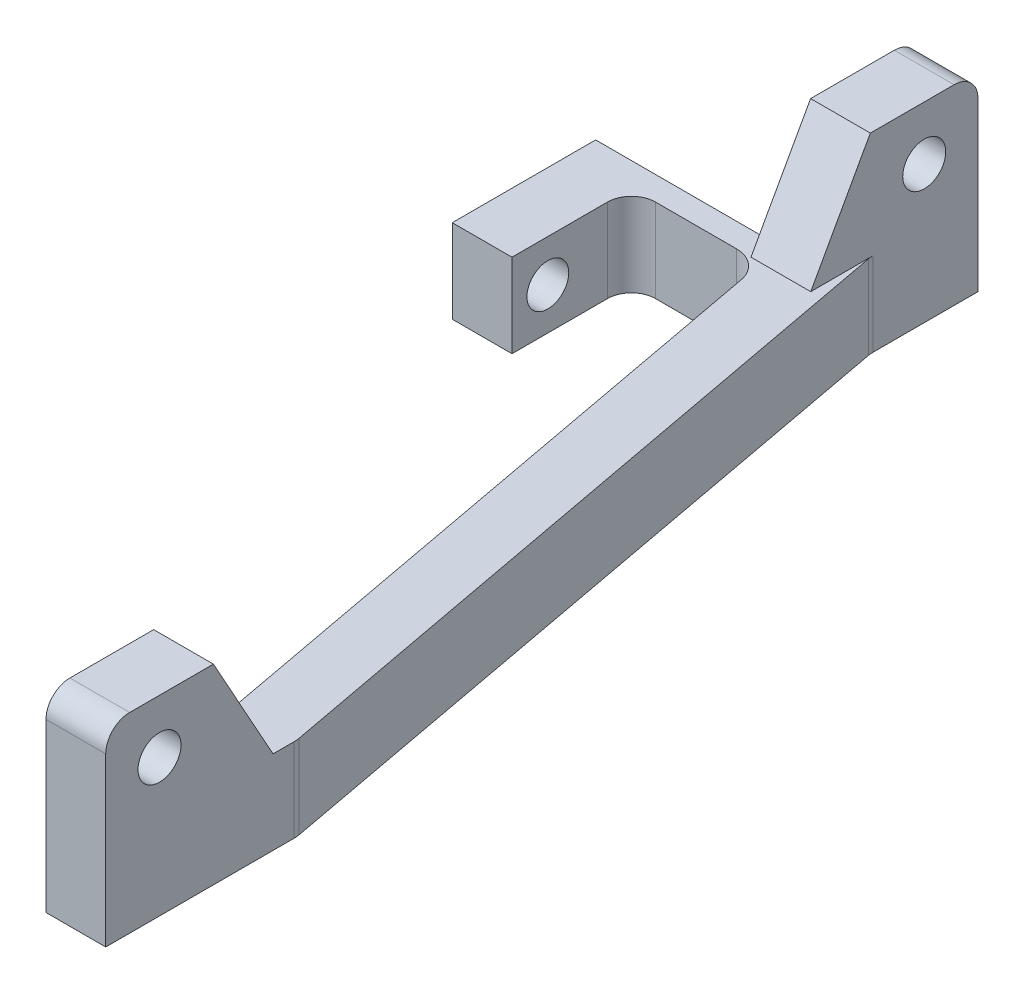
ISO-10303-21;
HEADER;
FILE_DESCRIPTION(('STEP AP214'),'2;1');
FILE_NAME('part.step','',(''),(''),'','','');
FILE_SCHEMA(('AUTOMOTIVE_DESIGN { 1 0 10303 214 1 1 1 1 }'));
ENDSEC;
DATA;
#1=APPLICATION_CONTEXT('core data for automotive mechanical design processes');
#2=APPLICATION_PROTOCOL_DEFINITION('international standard','automotive_design',2000,#1);
#3=PRODUCT_CONTEXT('',#1,'mechanical');
#4=PRODUCT('Part','Part','',(#3));
#5=PRODUCT_RELATED_PRODUCT_CATEGORY('part','',(#4));
#6=PRODUCT_DEFINITION_FORMATION('','',#4);
#7=PRODUCT_DEFINITION_CONTEXT('part definition',#1,'design');
#8=PRODUCT_DEFINITION('design','',#6,#7);
#9=PRODUCT_DEFINITION_SHAPE('','',#8);
#10=(LENGTH_UNIT() NAMED_UNIT(*) SI_UNIT(.MILLI.,.METRE.));
#11=(NAMED_UNIT(*) PLANE_ANGLE_UNIT() SI_UNIT($,.RADIAN.));
#12=(NAMED_UNIT(*) SI_UNIT($,.STERADIAN.) SOLID_ANGLE_UNIT());
#13=UNCERTAINTY_MEASURE_WITH_UNIT(LENGTH_MEASURE(1.E-05),#10,'distance_accuracy_value','');
#14=(GEOMETRIC_REPRESENTATION_CONTEXT(3) GLOBAL_UNCERTAINTY_ASSIGNED_CONTEXT((#13)) GLOBAL_UNIT_ASSIGNED_CONTEXT((#10,
#11,#12)) REPRESENTATION_CONTEXT('',''));
#15=CARTESIAN_POINT('',(0.,0.,0.));
#16=DIRECTION('',(0.,0.,1.));
#17=DIRECTION('',(1.,0.,0.));
#18=AXIS2_PLACEMENT_3D('',#15,#16,#17);
#19=CARTESIAN_POINT('',(0.,7.,0.));
#20=DIRECTION('',(0.,1.,0.));
#21=DIRECTION('',(0.,0.,1.));
#22=AXIS2_PLACEMENT_3D('',#19,#20,#21);
#23=PLANE('',#22);
#24=DIRECTION('',(-1.,0.,0.));
#25=VECTOR('',#24,1.);
#26=CARTESIAN_POINT('',(0.,7.,-63.));
#27=LINE('',#26,#25);
#28=CARTESIAN_POINT('',(12.5,7.,-63.));
#29=VERTEX_POINT('',#28);
#30=CARTESIAN_POINT('',(-2.50000000000002,7.,-63.));
#31=VERTEX_POINT('',#30);
#32=EDGE_CURVE('E357',#29,#31,#27,.T.);
#33=ORIENTED_EDGE('',*,*,#32,.T.);
#34=DIRECTION('',(0.,0.,1.));
#35=VECTOR('',#34,1.);
#36=CARTESIAN_POINT('',(-2.50000000000002,7.00000000000001,-75.002));
#37=LINE('',#36,#35);
#38=CARTESIAN_POINT('',(-2.50000000000002,7.00000000000001,-51.));
#39=VERTEX_POINT('',#38);
#40=EDGE_CURVE('E238',#31,#39,#37,.T.);
#41=ORIENTED_EDGE('',*,*,#40,.T.);
#42=DIRECTION('',(-1.,0.,0.));
#43=VECTOR('',#42,1.);
#44=CARTESIAN_POINT('',(-2.50000000000002,7.00000000000001,-51.));
#45=LINE('',#44,#43);
#46=CARTESIAN_POINT('',(2.49999999999998,7.00000000000001,-51.));
#47=VERTEX_POINT('',#46);
#48=EDGE_CURVE('E366',#47,#39,#45,.T.);
#49=ORIENTED_EDGE('',*,*,#48,.F.);
#50=DIRECTION('',(0.,0.,1.));
#51=VECTOR('',#50,1.);
#52=CARTESIAN_POINT('',(2.49999999999998,7.00000000000001,-75.002));
#53=LINE('',#52,#51);
#54=CARTESIAN_POINT('',(2.49999999999998,7.00000000000001,-59.));
#55=VERTEX_POINT('',#54);
#56=EDGE_CURVE('E392',#55,#47,#53,.T.);
#57=ORIENTED_EDGE('',*,*,#56,.F.);
#58=CARTESIAN_POINT('',(4.49999999999998,7.,-59.));
#59=DIRECTION('',(0.,1.,0.));
#60=DIRECTION('',(0.,0.,1.));
#61=AXIS2_PLACEMENT_3D('',#58,#59,#60);
#62=CIRCLE('',#61,2.);
#63=CARTESIAN_POINT('',(4.49999999999998,7.,-61.));
#64=VERTEX_POINT('',#63);
#65=EDGE_CURVE('E49',#55,#64,#62,.F.);
#66=ORIENTED_EDGE('',*,*,#65,.T.);
#67=DIRECTION('',(-1.,0.,0.));
#68=VECTOR('',#67,1.);
#69=CARTESIAN_POINT('',(0.,7.,-61.));
#70=LINE('',#69,#68);
#71=CARTESIAN_POINT('',(11.2690680907846,7.,-61.));
#72=VERTEX_POINT('',#71);
#73=EDGE_CURVE('E253',#72,#64,#70,.T.);
#74=ORIENTED_EDGE('',*,*,#73,.F.);
#75=CARTESIAN_POINT('',(11.2690680907846,7.,-58.5));
#76=DIRECTION('',(0.,1.,0.));
#77=DIRECTION('',(0.,0.,1.));
#78=AXIS2_PLACEMENT_3D('',#75,#76,#77);
#79=CIRCLE('',#78,2.5);
#80=CARTESIAN_POINT('',(13.7267188381452,7.,-58.9582060715418));
#81=VERTEX_POINT('',#80);
#82=EDGE_CURVE('E318',#72,#81,#79,.F.);
#83=ORIENTED_EDGE('',*,*,#82,.T.);
#84=DIRECTION('',(-0.183282428616724,0.,-0.983060298944249));
#85=VECTOR('',#84,1.);
#86=CARTESIAN_POINT('',(23.8885574725192,7.,-4.45379885080866));
#87=LINE('',#86,#85);
#88=CARTESIAN_POINT('',(23.3714927513865,7.,-7.22714599142935));
#89=VERTEX_POINT('',#88);
#90=EDGE_CURVE('E256',#89,#81,#87,.T.);
#91=ORIENTED_EDGE('',*,*,#90,.F.);
#92=CARTESIAN_POINT('',(20.9138420040259,7.,-6.76893991988754));
#93=DIRECTION('',(0.,1.,0.));
#94=DIRECTION('',(0.,0.,1.));
#95=AXIS2_PLACEMENT_3D('',#92,#93,#94);
#96=CIRCLE('',#95,2.5);
#97=CARTESIAN_POINT('',(23.4138420040259,7.,-6.76893991988754));
#98=VERTEX_POINT('',#97);
#99=EDGE_CURVE('E322',#89,#98,#96,.F.);
#100=ORIENTED_EDGE('',*,*,#99,.T.);
#101=DIRECTION('',(0.,0.,-1.));
#102=VECTOR('',#101,1.);
#103=CARTESIAN_POINT('',(23.4138420040259,7.,0.));
#104=LINE('',#103,#102);
#105=CARTESIAN_POINT('',(23.4138420040259,7.,-5.0215379003105));
#106=VERTEX_POINT('',#105);
#107=EDGE_CURVE('E426',#106,#98,#104,.T.);
#108=ORIENTED_EDGE('',*,*,#107,.F.);
#109=CARTESIAN_POINT('',(25.9138420040259,7.,-5.0215379003105));
#110=DIRECTION('',(0.,1.,0.));
#111=DIRECTION('',(0.,0.,1.));
#112=AXIS2_PLACEMENT_3D('',#109,#110,#111);
#113=CIRCLE('',#112,2.5);
#114=CARTESIAN_POINT('',(23.4139347819774,7.,-5.00000000000002));
#115=VERTEX_POINT('',#114);
#116=EDGE_CURVE('E292',#106,#115,#113,.T.);
#117=ORIENTED_EDGE('',*,*,#116,.T.);
#118=DIRECTION('',(1.,0.,0.));
#119=VECTOR('',#118,1.);
#120=CARTESIAN_POINT('',(0.,7.,-5.00000000000006));
#121=LINE('',#120,#119);
#122=CARTESIAN_POINT('',(28.5,7.,-5.00000000000001));
#123=VERTEX_POINT('',#122);
#124=EDGE_CURVE('E324',#115,#123,#121,.T.);
#125=ORIENTED_EDGE('',*,*,#124,.T.);
#126=DIRECTION('',(0.,0.,-1.));
#127=VECTOR('',#126,1.);
#128=CARTESIAN_POINT('',(28.5,7.,0.));
#129=LINE('',#128,#127);
#130=CARTESIAN_POINT('',(28.5,7.,-6.76893991988753));
#131=VERTEX_POINT('',#130);
#132=EDGE_CURVE('E429',#123,#131,#129,.T.);
#133=ORIENTED_EDGE('',*,*,#132,.T.);
#134=CARTESIAN_POINT('',(26.,7.,-6.76893991988753));
#135=DIRECTION('',(0.,1.,0.));
#136=DIRECTION('',(0.,0.,1.));
#137=AXIS2_PLACEMENT_3D('',#134,#135,#136);
#138=CIRCLE('',#137,2.5);
#139=CARTESIAN_POINT('',(28.4576507473606,7.,-7.22714599142935));
#140=VERTEX_POINT('',#139);
#141=EDGE_CURVE('E295',#131,#140,#138,.T.);
#142=ORIENTED_EDGE('',*,*,#141,.T.);
#143=DIRECTION('',(-0.183282428616724,0.,-0.983060298944249));
#144=VECTOR('',#143,1.);
#145=CARTESIAN_POINT('',(28.8038589672404,7.,-5.37021099389228));
#146=LINE('',#145,#144);
#147=CARTESIAN_POINT('',(17.5423492526394,7.,-65.7728540085706));
#148=VERTEX_POINT('',#147);
#149=EDGE_CURVE('E264',#140,#148,#146,.T.);
#150=ORIENTED_EDGE('',*,*,#149,.T.);
#151=CARTESIAN_POINT('',(20.,7.,-66.2310600801124));
#152=DIRECTION('',(0.,1.,0.));
#153=DIRECTION('',(0.,0.,1.));
#154=AXIS2_PLACEMENT_3D('',#151,#152,#153);
#155=CIRCLE('',#154,2.5);
#156=CARTESIAN_POINT('',(17.5,7.,-66.2310600801124));
#157=VERTEX_POINT('',#156);
#158=EDGE_CURVE('E314',#148,#157,#155,.F.);
#159=ORIENTED_EDGE('',*,*,#158,.T.);
#160=DIRECTION('',(0.,0.,-1.));
#161=VECTOR('',#160,1.);
#162=CARTESIAN_POINT('',(17.5,7.,0.));
#163=LINE('',#162,#161);
#164=CARTESIAN_POINT('',(17.5,7.,-60.9999999999999));
#165=VERTEX_POINT('',#164);
#166=EDGE_CURVE('E274',#165,#157,#163,.T.);
#167=ORIENTED_EDGE('',*,*,#166,.F.);
#168=DIRECTION('',(-1.,0.,0.));
#169=VECTOR('',#168,1.);
#170=CARTESIAN_POINT('',(12.5,7.,-60.9999999999999));
#171=LINE('',#170,#169);
#172=CARTESIAN_POINT('',(12.5,7.,-60.9999999999999));
#173=VERTEX_POINT('',#172);
#174=EDGE_CURVE('E327',#165,#173,#171,.T.);
#175=ORIENTED_EDGE('',*,*,#174,.T.);
#176=DIRECTION('',(0.,0.,-1.));
#177=VECTOR('',#176,1.);
#178=CARTESIAN_POINT('',(12.5000000000001,7.,0.));
#179=LINE('',#178,#177);
#180=EDGE_CURVE('E330',#173,#29,#179,.T.);
#181=ORIENTED_EDGE('',*,*,#180,.T.);
#182=EDGE_LOOP('',(#33,#41,#49,#57,#66,#74,#83,#91,#100,#108,#117,#125,#133,#142,#150,#159,#167,
#175,#181));
#183=FACE_BOUND('',#182,.T.);
#184=ADVANCED_FACE('F41',(#183),#23,.T.);
#185=CARTESIAN_POINT('',(0.,7.,-66.));
#186=DIRECTION('',(0.,0.,-1.));
#187=DIRECTION('',(-1.,0.,0.));
#188=AXIS2_PLACEMENT_3D('',#185,#186,#187);
#189=PLANE('',#188);
#190=DIRECTION('',(1.,0.,0.));
#191=VECTOR('',#190,1.);
#192=CARTESIAN_POINT('',(0.,0.,-66.));
#193=LINE('',#192,#191);
#194=CARTESIAN_POINT('',(-2.50000000000002,0.,-66.));
#195=VERTEX_POINT('',#194);
#196=CARTESIAN_POINT('',(12.5,0.,-66.));
#197=VERTEX_POINT('',#196);
#198=EDGE_CURVE('E230',#195,#197,#193,.T.);
#199=ORIENTED_EDGE('',*,*,#198,.F.);
#200=DIRECTION('',(0.,1.,0.));
#201=VECTOR('',#200,1.);
#202=CARTESIAN_POINT('',(-2.50000000000002,7.,-66.));
#203=LINE('',#202,#201);
#204=CARTESIAN_POINT('',(-2.50000000000002,4.,-66.));
#205=VERTEX_POINT('',#204);
#206=EDGE_CURVE('E241',#195,#205,#203,.T.);
#207=ORIENTED_EDGE('',*,*,#206,.T.);
#208=DIRECTION('',(1.,0.,0.));
#209=VECTOR('',#208,1.);
#210=CARTESIAN_POINT('',(0.,4.,-66.));
#211=LINE('',#210,#209);
#212=CARTESIAN_POINT('',(12.5,4.,-66.));
#213=VERTEX_POINT('',#212);
#214=EDGE_CURVE('E355',#205,#213,#211,.T.);
#215=ORIENTED_EDGE('',*,*,#214,.T.);
#216=DIRECTION('',(0.,-1.,0.));
#217=VECTOR('',#216,1.);
#218=CARTESIAN_POINT('',(12.5,7.,-66.));
#219=LINE('',#218,#217);
#220=EDGE_CURVE('E251',#213,#197,#219,.T.);
#221=ORIENTED_EDGE('',*,*,#220,.T.);
#222=EDGE_LOOP('',(#199,#207,#215,#221));
#223=FACE_BOUND('',#222,.T.);
#224=ADVANCED_FACE('F249',(#223),#189,.T.);
#225=CARTESIAN_POINT('',(0.,0.,0.));
#226=DIRECTION('',(0.,1.,0.));
#227=DIRECTION('',(0.,0.,1.));
#228=AXIS2_PLACEMENT_3D('',#225,#226,#227);
#229=PLANE('',#228);
#230=DIRECTION('',(0.,0.,1.));
#231=VECTOR('',#230,1.);
#232=CARTESIAN_POINT('',(-2.50000000000002,0.,-75.002));
#233=LINE('',#232,#231);
#234=CARTESIAN_POINT('',(-2.50000000000002,0.,-51.));
#235=VERTEX_POINT('',#234);
#236=EDGE_CURVE('E225',#195,#235,#233,.T.);
#237=ORIENTED_EDGE('',*,*,#236,.F.);
#238=ORIENTED_EDGE('',*,*,#198,.T.);
#239=DIRECTION('',(0.,0.,1.));
#240=VECTOR('',#239,1.);
#241=CARTESIAN_POINT('',(12.5000000000001,0.,0.));
#242=LINE('',#241,#240);
#243=CARTESIAN_POINT('',(12.5,0.,-75.));
#244=VERTEX_POINT('',#243);
#245=EDGE_CURVE('E254',#244,#197,#242,.T.);
#246=ORIENTED_EDGE('',*,*,#245,.F.);
#247=DIRECTION('',(-1.,0.,0.));
#248=VECTOR('',#247,1.);
#249=CARTESIAN_POINT('',(0.,0.,-75.));
#250=LINE('',#249,#248);
#251=CARTESIAN_POINT('',(17.5,0.,-75.));
#252=VERTEX_POINT('',#251);
#253=EDGE_CURVE('E258',#252,#244,#250,.T.);
#254=ORIENTED_EDGE('',*,*,#253,.F.);
#255=DIRECTION('',(0.,0.,-1.));
#256=VECTOR('',#255,1.);
#257=CARTESIAN_POINT('',(17.5,0.,0.));
#258=LINE('',#257,#256);
#259=CARTESIAN_POINT('',(17.5,0.,-66.2310600801124));
#260=VERTEX_POINT('',#259);
#261=EDGE_CURVE('E455',#260,#252,#258,.T.);
#262=ORIENTED_EDGE('',*,*,#261,.F.);
#263=CARTESIAN_POINT('',(20.,0.,-66.2310600801124));
#264=DIRECTION('',(0.,1.,0.));
#265=DIRECTION('',(0.,0.,1.));
#266=AXIS2_PLACEMENT_3D('',#263,#264,#265);
#267=CIRCLE('',#266,2.5);
#268=CARTESIAN_POINT('',(17.5423492526394,0.,-65.7728540085706));
#269=VERTEX_POINT('',#268);
#270=EDGE_CURVE('E312',#260,#269,#267,.T.);
#271=ORIENTED_EDGE('',*,*,#270,.T.);
#272=DIRECTION('',(-0.183282428616724,0.,-0.983060298944249));
#273=VECTOR('',#272,1.);
#274=CARTESIAN_POINT('',(28.8038589672404,0.,-5.37021099389228));
#275=LINE('',#274,#273);
#276=CARTESIAN_POINT('',(28.4576507473606,0.,-7.22714599142935));
#277=VERTEX_POINT('',#276);
#278=EDGE_CURVE('E452',#277,#269,#275,.T.);
#279=ORIENTED_EDGE('',*,*,#278,.F.);
#280=CARTESIAN_POINT('',(26.,0.,-6.76893991988753));
#281=DIRECTION('',(0.,1.,0.));
#282=DIRECTION('',(0.,0.,1.));
#283=AXIS2_PLACEMENT_3D('',#280,#281,#282);
#284=CIRCLE('',#283,2.5);
#285=CARTESIAN_POINT('',(28.5,0.,-6.76893991988753));
#286=VERTEX_POINT('',#285);
#287=EDGE_CURVE('E287',#277,#286,#284,.F.);
#288=ORIENTED_EDGE('',*,*,#287,.T.);
#289=DIRECTION('',(0.,0.,-1.));
#290=VECTOR('',#289,1.);
#291=CARTESIAN_POINT('',(28.5,0.,0.));
#292=LINE('',#291,#290);
#293=CARTESIAN_POINT('',(28.5,0.,9.));
#294=VERTEX_POINT('',#293);
#295=EDGE_CURVE('E449',#294,#286,#292,.T.);
#296=ORIENTED_EDGE('',*,*,#295,.F.);
#297=DIRECTION('',(1.,0.,0.));
#298=VECTOR('',#297,1.);
#299=CARTESIAN_POINT('',(0.,0.,8.99999999999999));
#300=LINE('',#299,#298);
#301=CARTESIAN_POINT('',(23.5,0.,9.));
#302=VERTEX_POINT('',#301);
#303=EDGE_CURVE('E446',#302,#294,#300,.T.);
#304=ORIENTED_EDGE('',*,*,#303,.F.);
#305=DIRECTION('',(0.,0.,1.));
#306=VECTOR('',#305,1.);
#307=CARTESIAN_POINT('',(23.5,0.,0.));
#308=LINE('',#307,#306);
#309=CARTESIAN_POINT('',(23.5,0.,0.));
#310=VERTEX_POINT('',#309);
#311=EDGE_CURVE('E443',#310,#302,#308,.T.);
#312=ORIENTED_EDGE('',*,*,#311,.F.);
#313=DIRECTION('',(-0.0172290414921653,0.,-0.999851569048757));
#314=VECTOR('',#313,1.);
#315=CARTESIAN_POINT('',(23.4930242630376,0.,-0.404822377974969));
#316=LINE('',#315,#314);
#317=CARTESIAN_POINT('',(23.414213081404,0.,-4.97846529658009));
#318=VERTEX_POINT('',#317);
#319=EDGE_CURVE('E440',#310,#318,#316,.T.);
#320=ORIENTED_EDGE('',*,*,#319,.T.);
#321=CARTESIAN_POINT('',(25.9138420040259,0.,-5.0215379003105));
#322=DIRECTION('',(0.,1.,0.));
#323=DIRECTION('',(0.,0.,1.));
#324=AXIS2_PLACEMENT_3D('',#321,#322,#323);
#325=CIRCLE('',#324,2.5);
#326=CARTESIAN_POINT('',(23.4138420040259,0.,-5.0215379003105));
#327=VERTEX_POINT('',#326);
#328=EDGE_CURVE('E285',#318,#327,#325,.F.);
#329=ORIENTED_EDGE('',*,*,#328,.T.);
#330=DIRECTION('',(0.,0.,-1.));
#331=VECTOR('',#330,1.);
#332=CARTESIAN_POINT('',(23.4138420040259,0.,0.));
#333=LINE('',#332,#331);
#334=CARTESIAN_POINT('',(23.4138420040259,0.,-6.76893991988754));
#335=VERTEX_POINT('',#334);
#336=EDGE_CURVE('E437',#327,#335,#333,.T.);
#337=ORIENTED_EDGE('',*,*,#336,.T.);
#338=CARTESIAN_POINT('',(20.9138420040259,0.,-6.76893991988754));
#339=DIRECTION('',(0.,1.,0.));
#340=DIRECTION('',(0.,0.,1.));
#341=AXIS2_PLACEMENT_3D('',#338,#339,#340);
#342=CIRCLE('',#341,2.5);
#343=CARTESIAN_POINT('',(23.3714927513865,0.,-7.22714599142935));
#344=VERTEX_POINT('',#343);
#345=EDGE_CURVE('E320',#335,#344,#342,.T.);
#346=ORIENTED_EDGE('',*,*,#345,.T.);
#347=DIRECTION('',(-0.183282428616724,0.,-0.983060298944249));
#348=VECTOR('',#347,1.);
#349=CARTESIAN_POINT('',(23.8885574725192,0.,-4.45379885080866));
#350=LINE('',#349,#348);
#351=CARTESIAN_POINT('',(13.7267188381452,0.,-58.9582060715418));
#352=VERTEX_POINT('',#351);
#353=EDGE_CURVE('E434',#344,#352,#350,.T.);
#354=ORIENTED_EDGE('',*,*,#353,.T.);
#355=CARTESIAN_POINT('',(11.2690680907846,0.,-58.5));
#356=DIRECTION('',(0.,1.,0.));
#357=DIRECTION('',(0.,0.,1.));
#358=AXIS2_PLACEMENT_3D('',#355,#356,#357);
#359=CIRCLE('',#358,2.5);
#360=CARTESIAN_POINT('',(11.2690680907846,0.,-61.));
#361=VERTEX_POINT('',#360);
#362=EDGE_CURVE('E316',#352,#361,#359,.T.);
#363=ORIENTED_EDGE('',*,*,#362,.T.);
#364=DIRECTION('',(-1.,0.,0.));
#365=VECTOR('',#364,1.);
#366=CARTESIAN_POINT('',(0.,0.,-61.));
#367=LINE('',#366,#365);
#368=CARTESIAN_POINT('',(4.49999999999998,0.,-61.));
#369=VERTEX_POINT('',#368);
#370=EDGE_CURVE('E422',#361,#369,#367,.T.);
#371=ORIENTED_EDGE('',*,*,#370,.T.);
#372=CARTESIAN_POINT('',(4.49999999999998,0.,-59.));
#373=DIRECTION('',(0.,1.,0.));
#374=DIRECTION('',(0.,0.,1.));
#375=AXIS2_PLACEMENT_3D('',#372,#373,#374);
#376=CIRCLE('',#375,2.);
#377=CARTESIAN_POINT('',(2.49999999999998,0.,-59.));
#378=VERTEX_POINT('',#377);
#379=EDGE_CURVE('E11',#369,#378,#376,.T.);
#380=ORIENTED_EDGE('',*,*,#379,.T.);
#381=DIRECTION('',(0.,0.,1.));
#382=VECTOR('',#381,1.);
#383=CARTESIAN_POINT('',(2.49999999999998,0.,-75.002));
#384=LINE('',#383,#382);
#385=CARTESIAN_POINT('',(2.49999999999998,0.,-51.));
#386=VERTEX_POINT('',#385);
#387=EDGE_CURVE('E237',#378,#386,#384,.T.);
#388=ORIENTED_EDGE('',*,*,#387,.T.);
#389=DIRECTION('',(1.,0.,0.));
#390=VECTOR('',#389,1.);
#391=CARTESIAN_POINT('',(2.49999999999998,0.,-51.));
#392=LINE('',#391,#390);
#393=EDGE_CURVE('E233',#235,#386,#392,.T.);
#394=ORIENTED_EDGE('',*,*,#393,.F.);
#395=EDGE_LOOP('',(#237,#238,#246,#254,#262,#271,#279,#288,#296,#304,#312,#320,#329,#337,#346,
#354,#363,#371,#380,#388,#394));
#396=FACE_BOUND('',#395,.T.);
#397=ADVANCED_FACE('F227',(#396),#229,.F.);
#398=CARTESIAN_POINT('',(0.,4.,-66.));
#399=DIRECTION('',(0.,-0.707106781186549,0.707106781186546));
#400=DIRECTION('',(1.,0.,0.));
#401=AXIS2_PLACEMENT_3D('',#398,#399,#400);
#402=PLANE('',#401);
#403=ORIENTED_EDGE('',*,*,#214,.F.);
#404=DIRECTION('',(0.,-0.707106781186546,-0.707106781186549));
#405=VECTOR('',#404,1.);
#406=CARTESIAN_POINT('',(-2.50000000000002,4.,-66.));
#407=LINE('',#406,#405);
#408=EDGE_CURVE('E244',#205,#31,#407,.F.);
#409=ORIENTED_EDGE('',*,*,#408,.T.);
#410=ORIENTED_EDGE('',*,*,#32,.F.);
#411=DIRECTION('',(0.,-0.707106781186546,-0.707106781186549));
#412=VECTOR('',#411,1.);
#413=CARTESIAN_POINT('',(12.5,38.5,-31.4999999999999));
#414=LINE('',#413,#412);
#415=EDGE_CURVE('E360',#213,#29,#414,.F.);
#416=ORIENTED_EDGE('',*,*,#415,.F.);
#417=EDGE_LOOP('',(#403,#409,#410,#416));
#418=FACE_BOUND('',#417,.T.);
#419=ADVANCED_FACE('F493',(#418),#402,.F.);
#420=CARTESIAN_POINT('',(0.,7.,-61.));
#421=DIRECTION('',(0.,0.,1.));
#422=DIRECTION('',(1.,0.,0.));
#423=AXIS2_PLACEMENT_3D('',#420,#421,#422);
#424=PLANE('',#423);
#425=ORIENTED_EDGE('',*,*,#73,.T.);
#426=DIRECTION('',(0.,1.,0.));
#427=VECTOR('',#426,1.);
#428=CARTESIAN_POINT('',(4.49999999999998,0.,-61.));
#429=LINE('',#428,#427);
#430=EDGE_CURVE('E62',#64,#369,#429,.F.);
#431=ORIENTED_EDGE('',*,*,#430,.T.);
#432=ORIENTED_EDGE('',*,*,#370,.F.);
#433=DIRECTION('',(0.,-1.,0.));
#434=VECTOR('',#433,1.);
#435=CARTESIAN_POINT('',(11.2690680907846,7.,-61.));
#436=LINE('',#435,#434);
#437=EDGE_CURVE('E302',#361,#72,#436,.F.);
#438=ORIENTED_EDGE('',*,*,#437,.T.);
#439=EDGE_LOOP('',(#425,#431,#432,#438));
#440=FACE_BOUND('',#439,.T.);
#441=ADVANCED_FACE('F563',(#440),#424,.T.);
#442=CARTESIAN_POINT('',(23.8885574725192,7.,-4.45379885080866));
#443=DIRECTION('',(-0.983060298944249,0.,0.183282428616724));
#444=DIRECTION('',(0.183282428616724,0.,0.983060298944249));
#445=AXIS2_PLACEMENT_3D('',#442,#443,#444);
#446=PLANE('',#445);
#447=ORIENTED_EDGE('',*,*,#90,.T.);
#448=DIRECTION('',(0.,-1.,0.));
#449=VECTOR('',#448,1.);
#450=CARTESIAN_POINT('',(13.7267188381452,0.,-58.9582060715418));
#451=LINE('',#450,#449);
#452=EDGE_CURVE('E299',#81,#352,#451,.T.);
#453=ORIENTED_EDGE('',*,*,#452,.T.);
#454=ORIENTED_EDGE('',*,*,#353,.F.);
#455=DIRECTION('',(0.,-1.,0.));
#456=VECTOR('',#455,1.);
#457=CARTESIAN_POINT('',(23.3714927513865,7.,-7.22714599142935));
#458=LINE('',#457,#456);
#459=EDGE_CURVE('E297',#344,#89,#458,.F.);
#460=ORIENTED_EDGE('',*,*,#459,.T.);
#461=EDGE_LOOP('',(#447,#453,#454,#460));
#462=FACE_BOUND('',#461,.T.);
#463=ADVANCED_FACE('F559',(#462),#446,.T.);
#464=CARTESIAN_POINT('',(23.4138420040259,7.,0.));
#465=DIRECTION('',(-1.,0.,0.));
#466=DIRECTION('',(0.,0.,1.));
#467=AXIS2_PLACEMENT_3D('',#464,#465,#466);
#468=PLANE('',#467);
#469=ORIENTED_EDGE('',*,*,#107,.T.);
#470=DIRECTION('',(0.,-1.,0.));
#471=VECTOR('',#470,1.);
#472=CARTESIAN_POINT('',(23.4138420040259,0.,-6.76893991988754));
#473=LINE('',#472,#471);
#474=EDGE_CURVE('E306',#98,#335,#473,.T.);
#475=ORIENTED_EDGE('',*,*,#474,.T.);
#476=ORIENTED_EDGE('',*,*,#336,.F.);
#477=DIRECTION('',(0.,-1.,0.));
#478=VECTOR('',#477,1.);
#479=CARTESIAN_POINT('',(23.4138420040259,7.,-5.0215379003105));
#480=LINE('',#479,#478);
#481=EDGE_CURVE('E304',#327,#106,#480,.F.);
#482=ORIENTED_EDGE('',*,*,#481,.T.);
#483=EDGE_LOOP('',(#469,#475,#476,#482));
#484=FACE_BOUND('',#483,.T.);
#485=ADVANCED_FACE('F555',(#484),#468,.T.);
#486=CARTESIAN_POINT('',(23.4930242630376,7.,-0.404822377974969));
#487=DIRECTION('',(-0.999851569048757,0.,0.0172290414921653));
#488=DIRECTION('',(0.0172290414921653,0.,0.999851569048757));
#489=AXIS2_PLACEMENT_3D('',#486,#487,#488);
#490=PLANE('',#489);
#491=DIRECTION('',(0.,-1.,0.));
#492=VECTOR('',#491,1.);
#493=CARTESIAN_POINT('',(23.5,7.,0.));
#494=LINE('',#493,#492);
#495=CARTESIAN_POINT('',(23.5,16.,0.));
#496=VERTEX_POINT('',#495);
#497=EDGE_CURVE('E272',#496,#310,#494,.T.);
#498=ORIENTED_EDGE('',*,*,#497,.F.);
#499=DIRECTION('',(-0.0172290414921653,0.,-0.999851569048757));
#500=VECTOR('',#499,1.);
#501=CARTESIAN_POINT('',(23.4930242630376,16.,-0.404822377974969));
#502=LINE('',#501,#500);
#503=CARTESIAN_POINT('',(23.4998066866682,16.,-0.0112185369251466));
#504=VERTEX_POINT('',#503);
#505=EDGE_CURVE('E352',#496,#504,#502,.T.);
#506=ORIENTED_EDGE('',*,*,#505,.T.);
#507=DIRECTION('',(-0.00835375356244777,-0.874589188851984,-0.484792703683385));
#508=VECTOR('',#507,1.);
#509=CARTESIAN_POINT('',(23.4983600478333,15.8485453663841,-0.0951712112228973));
#510=LINE('',#509,#508);
#511=CARTESIAN_POINT('',(23.414213081404,7.03884963336516,-4.97846529658009));
#512=VERTEX_POINT('',#511);
#513=EDGE_CURVE('E344',#504,#512,#510,.T.);
#514=ORIENTED_EDGE('',*,*,#513,.T.);
#515=DIRECTION('',(0.,-1.,0.));
#516=VECTOR('',#515,1.);
#517=CARTESIAN_POINT('',(23.414213081404,7.,-4.97846529658009));
#518=LINE('',#517,#516);
#519=EDGE_CURVE('E309',#512,#318,#518,.T.);
#520=ORIENTED_EDGE('',*,*,#519,.T.);
#521=ORIENTED_EDGE('',*,*,#319,.F.);
#522=EDGE_LOOP('',(#498,#506,#514,#520,#521));
#523=FACE_BOUND('',#522,.T.);
#524=ADVANCED_FACE('F551',(#523),#490,.T.);
#525=CARTESIAN_POINT('',(23.5,7.,0.));
#526=DIRECTION('',(1.,0.,0.));
#527=DIRECTION('',(0.,0.,-1.));
#528=AXIS2_PLACEMENT_3D('',#525,#526,#527);
#529=PLANE('',#528);
#530=CARTESIAN_POINT('',(23.5,11.5,4.50000000000003));
#531=DIRECTION('',(1.,0.,0.));
#532=DIRECTION('',(0.,0.,-1.));
#533=AXIS2_PLACEMENT_3D('',#530,#531,#532);
#534=CIRCLE('',#533,1.79999999999999);
#535=CARTESIAN_POINT('',(23.5,11.5,2.70000000000004));
#536=VERTEX_POINT('',#535);
#537=EDGE_CURVE('E401',#536,#536,#534,.T.);
#538=ORIENTED_EDGE('',*,*,#537,.T.);
#539=EDGE_LOOP('',(#538));
#540=FACE_BOUND('',#539,.T.);
#541=DIRECTION('',(0.,-1.,0.));
#542=VECTOR('',#541,1.);
#543=CARTESIAN_POINT('',(23.5,7.,9.));
#544=LINE('',#543,#542);
#545=CARTESIAN_POINT('',(23.5,14.,9.));
#546=VERTEX_POINT('',#545);
#547=EDGE_CURVE('E270',#546,#302,#544,.T.);
#548=ORIENTED_EDGE('',*,*,#547,.F.);
#549=CARTESIAN_POINT('',(23.5,14.,7.));
#550=DIRECTION('',(1.,0.,0.));
#551=DIRECTION('',(0.,0.,-1.));
#552=AXIS2_PLACEMENT_3D('',#549,#550,#551);
#553=CIRCLE('',#552,2.);
#554=CARTESIAN_POINT('',(23.5,16.,7.));
#555=VERTEX_POINT('',#554);
#556=EDGE_CURVE('E369',#546,#555,#553,.F.);
#557=ORIENTED_EDGE('',*,*,#556,.T.);
#558=DIRECTION('',(0.,0.,-1.));
#559=VECTOR('',#558,1.);
#560=CARTESIAN_POINT('',(23.5,16.,0.));
#561=LINE('',#560,#559);
#562=EDGE_CURVE('E413',#555,#496,#561,.T.);
#563=ORIENTED_EDGE('',*,*,#562,.T.);
#564=ORIENTED_EDGE('',*,*,#497,.T.);
#565=ORIENTED_EDGE('',*,*,#311,.T.);
#566=EDGE_LOOP('',(#548,#557,#563,#564,#565));
#567=FACE_BOUND('',#566,.T.);
#568=ADVANCED_FACE('F547',(#540,#567),#529,.F.);
#569=CARTESIAN_POINT('',(0.,7.,8.99999999999999));
#570=DIRECTION('',(0.,0.,-1.));
#571=DIRECTION('',(-1.,0.,0.));
#572=AXIS2_PLACEMENT_3D('',#569,#570,#571);
#573=PLANE('',#572);
#574=DIRECTION('',(0.,-1.,0.));
#575=VECTOR('',#574,1.);
#576=CARTESIAN_POINT('',(28.5,7.,9.));
#577=LINE('',#576,#575);
#578=CARTESIAN_POINT('',(28.5,14.,9.));
#579=VERTEX_POINT('',#578);
#580=EDGE_CURVE('E268',#579,#294,#577,.T.);
#581=ORIENTED_EDGE('',*,*,#580,.F.);
#582=DIRECTION('',(-1.,0.,0.));
#583=VECTOR('',#582,1.);
#584=CARTESIAN_POINT('',(23.5,14.,9.));
#585=LINE('',#584,#583);
#586=EDGE_CURVE('E362',#579,#546,#585,.T.);
#587=ORIENTED_EDGE('',*,*,#586,.T.);
#588=ORIENTED_EDGE('',*,*,#547,.T.);
#589=ORIENTED_EDGE('',*,*,#303,.T.);
#590=EDGE_LOOP('',(#581,#587,#588,#589));
#591=FACE_BOUND('',#590,.T.);
#592=ADVANCED_FACE('F543',(#591),#573,.F.);
#593=CARTESIAN_POINT('',(28.5,7.,0.));
#594=DIRECTION('',(-1.,0.,0.));
#595=DIRECTION('',(0.,0.,1.));
#596=AXIS2_PLACEMENT_3D('',#593,#594,#595);
#597=PLANE('',#596);
#598=CARTESIAN_POINT('',(28.5,11.5,4.50000000000003));
#599=DIRECTION('',(1.,0.,0.));
#600=DIRECTION('',(0.,0.,-1.));
#601=AXIS2_PLACEMENT_3D('',#598,#599,#600);
#602=CIRCLE('',#601,1.79999999999999);
#603=CARTESIAN_POINT('',(28.5,11.5,2.70000000000004));
#604=VERTEX_POINT('',#603);
#605=EDGE_CURVE('E398',#604,#604,#602,.T.);
#606=ORIENTED_EDGE('',*,*,#605,.F.);
#607=EDGE_LOOP('',(#606));
#608=FACE_BOUND('',#607,.T.);
#609=DIRECTION('',(0.,0.,1.));
#610=VECTOR('',#609,1.);
#611=CARTESIAN_POINT('',(28.5,16.,0.));
#612=LINE('',#611,#610);
#613=CARTESIAN_POINT('',(28.5,16.,-0.0112185369251379));
#614=VERTEX_POINT('',#613);
#615=CARTESIAN_POINT('',(28.5,16.,7.));
#616=VERTEX_POINT('',#615);
#617=EDGE_CURVE('E415',#614,#616,#612,.T.);
#618=ORIENTED_EDGE('',*,*,#617,.T.);
#619=CARTESIAN_POINT('',(28.5,14.,7.));
#620=DIRECTION('',(-1.,0.,0.));
#621=DIRECTION('',(0.,0.,1.));
#622=AXIS2_PLACEMENT_3D('',#619,#620,#621);
#623=CIRCLE('',#622,2.);
#624=EDGE_CURVE('E373',#616,#579,#623,.F.);
#625=ORIENTED_EDGE('',*,*,#624,.T.);
#626=ORIENTED_EDGE('',*,*,#580,.T.);
#627=ORIENTED_EDGE('',*,*,#295,.T.);
#628=DIRECTION('',(0.,-1.,0.));
#629=VECTOR('',#628,1.);
#630=CARTESIAN_POINT('',(28.5,7.,-6.76893991988753));
#631=LINE('',#630,#629);
#632=EDGE_CURVE('E289',#286,#131,#631,.F.);
#633=ORIENTED_EDGE('',*,*,#632,.T.);
#634=ORIENTED_EDGE('',*,*,#132,.F.);
#635=DIRECTION('',(0.,0.874619707139398,0.484809620246334));
#636=VECTOR('',#635,1.);
#637=CARTESIAN_POINT('',(28.5,9.12012024039106,-3.82479816058304));
#638=LINE('',#637,#636);
#639=EDGE_CURVE('E349',#123,#614,#638,.T.);
#640=ORIENTED_EDGE('',*,*,#639,.T.);
#641=EDGE_LOOP('',(#618,#625,#626,#627,#633,#634,#640));
#642=FACE_BOUND('',#641,.T.);
#643=ADVANCED_FACE('F540',(#608,#642),#597,.F.);
#644=CARTESIAN_POINT('',(28.8038589672404,7.,-5.37021099389228));
#645=DIRECTION('',(-0.983060298944249,0.,0.183282428616724));
#646=DIRECTION('',(0.183282428616724,0.,0.983060298944249));
#647=AXIS2_PLACEMENT_3D('',#644,#645,#646);
#648=PLANE('',#647);
#649=ORIENTED_EDGE('',*,*,#278,.T.);
#650=DIRECTION('',(0.,-1.,0.));
#651=VECTOR('',#650,1.);
#652=CARTESIAN_POINT('',(17.5423492526394,7.,-65.7728540085706));
#653=LINE('',#652,#651);
#654=EDGE_CURVE('E283',#269,#148,#653,.F.);
#655=ORIENTED_EDGE('',*,*,#654,.T.);
#656=ORIENTED_EDGE('',*,*,#149,.F.);
#657=DIRECTION('',(0.,-1.,0.));
#658=VECTOR('',#657,1.);
#659=CARTESIAN_POINT('',(28.4576507473606,7.,-7.22714599142935));
#660=LINE('',#659,#658);
#661=EDGE_CURVE('E280',#140,#277,#660,.T.);
#662=ORIENTED_EDGE('',*,*,#661,.T.);
#663=EDGE_LOOP('',(#649,#655,#656,#662));
#664=FACE_BOUND('',#663,.T.);
#665=ADVANCED_FACE('F479',(#664),#648,.F.);
#666=CARTESIAN_POINT('',(17.5,7.,0.));
#667=DIRECTION('',(-1.,0.,0.));
#668=DIRECTION('',(0.,0.,1.));
#669=AXIS2_PLACEMENT_3D('',#666,#667,#668);
#670=PLANE('',#669);
#671=CARTESIAN_POINT('',(17.5,11.5,-70.4999999999998));
#672=DIRECTION('',(-1.,0.,0.));
#673=DIRECTION('',(0.,0.,1.));
#674=AXIS2_PLACEMENT_3D('',#671,#672,#673);
#675=CIRCLE('',#674,1.79999999999999);
#676=CARTESIAN_POINT('',(17.5,11.5,-68.6999999999998));
#677=VERTEX_POINT('',#676);
#678=EDGE_CURVE('E410',#677,#677,#675,.T.);
#679=ORIENTED_EDGE('',*,*,#678,.T.);
#680=EDGE_LOOP('',(#679));
#681=FACE_BOUND('',#680,.T.);
#682=DIRECTION('',(0.,-1.,0.));
#683=VECTOR('',#682,1.);
#684=CARTESIAN_POINT('',(17.5,7.,-75.));
#685=LINE('',#684,#683);
#686=CARTESIAN_POINT('',(17.5,14.,-75.));
#687=VERTEX_POINT('',#686);
#688=EDGE_CURVE('E266',#687,#252,#685,.T.);
#689=ORIENTED_EDGE('',*,*,#688,.F.);
#690=CARTESIAN_POINT('',(17.5,14.,-73.));
#691=DIRECTION('',(-1.,0.,0.));
#692=DIRECTION('',(0.,0.,1.));
#693=AXIS2_PLACEMENT_3D('',#690,#691,#692);
#694=CIRCLE('',#693,2.);
#695=CARTESIAN_POINT('',(17.5,16.,-73.));
#696=VERTEX_POINT('',#695);
#697=EDGE_CURVE('E378',#687,#696,#694,.F.);
#698=ORIENTED_EDGE('',*,*,#697,.T.);
#699=DIRECTION('',(0.,0.,1.));
#700=VECTOR('',#699,1.);
#701=CARTESIAN_POINT('',(17.5,16.,0.));
#702=LINE('',#701,#700);
#703=CARTESIAN_POINT('',(17.5,16.,-65.9887814630748));
#704=VERTEX_POINT('',#703);
#705=EDGE_CURVE('E418',#696,#704,#702,.T.);
#706=ORIENTED_EDGE('',*,*,#705,.T.);
#707=DIRECTION('',(0.,0.874619707139398,-0.484809620246334));
#708=VECTOR('',#707,1.);
#709=CARTESIAN_POINT('',(17.5,-18.8654669327708,-46.6625375591129));
#710=LINE('',#709,#708);
#711=EDGE_CURVE('E339',#704,#165,#710,.F.);
#712=ORIENTED_EDGE('',*,*,#711,.T.);
#713=ORIENTED_EDGE('',*,*,#166,.T.);
#714=DIRECTION('',(0.,-1.,0.));
#715=VECTOR('',#714,1.);
#716=CARTESIAN_POINT('',(17.5,0.,-66.2310600801124));
#717=LINE('',#716,#715);
#718=EDGE_CURVE('E277',#157,#260,#717,.T.);
#719=ORIENTED_EDGE('',*,*,#718,.T.);
#720=ORIENTED_EDGE('',*,*,#261,.T.);
#721=EDGE_LOOP('',(#689,#698,#706,#712,#713,#719,#720));
#722=FACE_BOUND('',#721,.T.);
#723=ADVANCED_FACE('F472',(#681,#722),#670,.F.);
#724=CARTESIAN_POINT('',(0.,7.,-75.));
#725=DIRECTION('',(0.,0.,1.));
#726=DIRECTION('',(1.,0.,0.));
#727=AXIS2_PLACEMENT_3D('',#724,#725,#726);
#728=PLANE('',#727);
#729=DIRECTION('',(0.,-1.,0.));
#730=VECTOR('',#729,1.);
#731=CARTESIAN_POINT('',(12.5,7.,-75.));
#732=LINE('',#731,#730);
#733=CARTESIAN_POINT('',(12.5,14.,-75.));
#734=VERTEX_POINT('',#733);
#735=EDGE_CURVE('E263',#734,#244,#732,.T.);
#736=ORIENTED_EDGE('',*,*,#735,.F.);
#737=DIRECTION('',(1.,0.,0.));
#738=VECTOR('',#737,1.);
#739=CARTESIAN_POINT('',(0.,14.,-75.));
#740=LINE('',#739,#738);
#741=EDGE_CURVE('E375',#734,#687,#740,.T.);
#742=ORIENTED_EDGE('',*,*,#741,.T.);
#743=ORIENTED_EDGE('',*,*,#688,.T.);
#744=ORIENTED_EDGE('',*,*,#253,.T.);
#745=EDGE_LOOP('',(#736,#742,#743,#744));
#746=FACE_BOUND('',#745,.T.);
#747=ADVANCED_FACE('F461',(#746),#728,.F.);
#748=CARTESIAN_POINT('',(12.5000000000001,7.,0.));
#749=DIRECTION('',(1.,0.,0.));
#750=DIRECTION('',(0.,0.,-1.));
#751=AXIS2_PLACEMENT_3D('',#748,#749,#750);
#752=PLANE('',#751);
#753=CARTESIAN_POINT('',(12.5,11.5,-70.4999999999998));
#754=DIRECTION('',(1.,0.,0.));
#755=DIRECTION('',(0.,0.,-1.));
#756=AXIS2_PLACEMENT_3D('',#753,#754,#755);
#757=CIRCLE('',#756,1.79999999999999);
#758=CARTESIAN_POINT('',(12.5,11.5,-72.2999999999998));
#759=VERTEX_POINT('',#758);
#760=EDGE_CURVE('E407',#759,#759,#757,.T.);
#761=ORIENTED_EDGE('',*,*,#760,.T.);
#762=EDGE_LOOP('',(#761));
#763=FACE_BOUND('',#762,.T.);
#764=DIRECTION('',(0.,0.,-1.));
#765=VECTOR('',#764,1.);
#766=CARTESIAN_POINT('',(12.5000000000001,16.,0.));
#767=LINE('',#766,#765);
#768=CARTESIAN_POINT('',(12.5,16.,-65.9887814630748));
#769=VERTEX_POINT('',#768);
#770=CARTESIAN_POINT('',(12.5,16.,-73.));
#771=VERTEX_POINT('',#770);
#772=EDGE_CURVE('E420',#769,#771,#767,.T.);
#773=ORIENTED_EDGE('',*,*,#772,.T.);
#774=CARTESIAN_POINT('',(12.5,14.,-73.));
#775=DIRECTION('',(1.,0.,0.));
#776=DIRECTION('',(0.,0.,-1.));
#777=AXIS2_PLACEMENT_3D('',#774,#775,#776);
#778=CIRCLE('',#777,2.);
#779=EDGE_CURVE('E382',#771,#734,#778,.F.);
#780=ORIENTED_EDGE('',*,*,#779,.T.);
#781=ORIENTED_EDGE('',*,*,#735,.T.);
#782=ORIENTED_EDGE('',*,*,#245,.T.);
#783=ORIENTED_EDGE('',*,*,#220,.F.);
#784=ORIENTED_EDGE('',*,*,#415,.T.);
#785=ORIENTED_EDGE('',*,*,#180,.F.);
#786=DIRECTION('',(0.,-0.874619707139398,0.484809620246334));
#787=VECTOR('',#786,1.);
#788=CARTESIAN_POINT('',(12.5,-18.8654669327708,-46.6625375591129));
#789=LINE('',#788,#787);
#790=EDGE_CURVE('E333',#173,#769,#789,.F.);
#791=ORIENTED_EDGE('',*,*,#790,.T.);
#792=EDGE_LOOP('',(#773,#780,#781,#782,#783,#784,#785,#791));
#793=FACE_BOUND('',#792,.T.);
#794=ADVANCED_FACE('F466',(#763,#793),#752,.F.);
#795=CARTESIAN_POINT('',(0.,16.,0.));
#796=DIRECTION('',(0.,-1.,0.));
#797=DIRECTION('',(0.,0.,-1.));
#798=AXIS2_PLACEMENT_3D('',#795,#796,#797);
#799=PLANE('',#798);
#800=ORIENTED_EDGE('',*,*,#705,.F.);
#801=DIRECTION('',(1.,0.,0.));
#802=VECTOR('',#801,1.);
#803=CARTESIAN_POINT('',(0.,16.,-73.));
#804=LINE('',#803,#802);
#805=EDGE_CURVE('E380',#696,#771,#804,.F.);
#806=ORIENTED_EDGE('',*,*,#805,.T.);
#807=ORIENTED_EDGE('',*,*,#772,.F.);
#808=DIRECTION('',(-1.,0.,0.));
#809=VECTOR('',#808,1.);
#810=CARTESIAN_POINT('',(0.,16.,-65.9887814630748));
#811=LINE('',#810,#809);
#812=EDGE_CURVE('E336',#769,#704,#811,.F.);
#813=ORIENTED_EDGE('',*,*,#812,.T.);
#814=EDGE_LOOP('',(#800,#806,#807,#813));
#815=FACE_BOUND('',#814,.T.);
#816=ADVANCED_FACE('F526',(#815),#799,.F.);
#817=CARTESIAN_POINT('',(0.,16.,0.));
#818=DIRECTION('',(0.,1.,0.));
#819=DIRECTION('',(0.,0.,1.));
#820=AXIS2_PLACEMENT_3D('',#817,#818,#819);
#821=PLANE('',#820);
#822=ORIENTED_EDGE('',*,*,#562,.F.);
#823=DIRECTION('',(-1.,0.,0.));
#824=VECTOR('',#823,1.);
#825=CARTESIAN_POINT('',(28.5,16.,7.));
#826=LINE('',#825,#824);
#827=EDGE_CURVE('E371',#555,#616,#826,.F.);
#828=ORIENTED_EDGE('',*,*,#827,.T.);
#829=ORIENTED_EDGE('',*,*,#617,.F.);
#830=DIRECTION('',(-1.,0.,0.));
#831=VECTOR('',#830,1.);
#832=CARTESIAN_POINT('',(0.,16.,-0.0112185369251874));
#833=LINE('',#832,#831);
#834=EDGE_CURVE('E342',#614,#504,#833,.T.);
#835=ORIENTED_EDGE('',*,*,#834,.T.);
#836=ORIENTED_EDGE('',*,*,#505,.F.);
#837=EDGE_LOOP('',(#822,#828,#829,#835,#836));
#838=FACE_BOUND('',#837,.T.);
#839=ADVANCED_FACE('F641',(#838),#821,.T.);
#840=CARTESIAN_POINT('',(28.5,11.5,-70.4999999999998));
#841=DIRECTION('',(1.,0.,0.));
#842=DIRECTION('',(0.,0.,-1.));
#843=AXIS2_PLACEMENT_3D('',#840,#841,#842);
#844=CYLINDRICAL_SURFACE('',#843,1.79999999999999);
#845=ORIENTED_EDGE('',*,*,#760,.F.);
#846=EDGE_LOOP('',(#845));
#847=FACE_BOUND('',#846,.T.);
#848=ORIENTED_EDGE('',*,*,#678,.F.);
#849=EDGE_LOOP('',(#848));
#850=FACE_BOUND('',#849,.T.);
#851=ADVANCED_FACE('F644',(#847,#850),#844,.F.);
#852=CARTESIAN_POINT('',(28.5,11.5,4.50000000000003));
#853=DIRECTION('',(1.,0.,0.));
#854=DIRECTION('',(0.,0.,-1.));
#855=AXIS2_PLACEMENT_3D('',#852,#853,#854);
#856=CYLINDRICAL_SURFACE('',#855,1.79999999999999);
#857=ORIENTED_EDGE('',*,*,#605,.T.);
#858=EDGE_LOOP('',(#857));
#859=FACE_BOUND('',#858,.T.);
#860=ORIENTED_EDGE('',*,*,#537,.F.);
#861=EDGE_LOOP('',(#860));
#862=FACE_BOUND('',#861,.T.);
#863=ADVANCED_FACE('F570',(#859,#862),#856,.F.);
#864=CARTESIAN_POINT('',(20.,7.,-66.2310600801124));
#865=DIRECTION('',(0.,1.,0.));
#866=DIRECTION('',(0.,0.,1.));
#867=AXIS2_PLACEMENT_3D('',#864,#865,#866);
#868=CYLINDRICAL_SURFACE('',#867,2.5);
#869=ORIENTED_EDGE('',*,*,#158,.F.);
#870=ORIENTED_EDGE('',*,*,#654,.F.);
#871=ORIENTED_EDGE('',*,*,#270,.F.);
#872=ORIENTED_EDGE('',*,*,#718,.F.);
#873=EDGE_LOOP('',(#869,#870,#871,#872));
#874=FACE_BOUND('',#873,.T.);
#875=ADVANCED_FACE('F483',(#874),#868,.F.);
#876=CARTESIAN_POINT('',(26.,7.,-6.76893991988753));
#877=DIRECTION('',(0.,-1.,0.));
#878=DIRECTION('',(0.,0.,-1.));
#879=AXIS2_PLACEMENT_3D('',#876,#877,#878);
#880=CYLINDRICAL_SURFACE('',#879,2.5);
#881=ORIENTED_EDGE('',*,*,#141,.F.);
#882=ORIENTED_EDGE('',*,*,#632,.F.);
#883=ORIENTED_EDGE('',*,*,#287,.F.);
#884=ORIENTED_EDGE('',*,*,#661,.F.);
#885=EDGE_LOOP('',(#881,#882,#883,#884));
#886=FACE_BOUND('',#885,.T.);
#887=ADVANCED_FACE('F569',(#886),#880,.T.);
#888=CARTESIAN_POINT('',(11.2690680907846,7.,-58.5));
#889=DIRECTION('',(0.,1.,0.));
#890=DIRECTION('',(0.,0.,1.));
#891=AXIS2_PLACEMENT_3D('',#888,#889,#890);
#892=CYLINDRICAL_SURFACE('',#891,2.5);
#893=ORIENTED_EDGE('',*,*,#82,.F.);
#894=ORIENTED_EDGE('',*,*,#437,.F.);
#895=ORIENTED_EDGE('',*,*,#362,.F.);
#896=ORIENTED_EDGE('',*,*,#452,.F.);
#897=EDGE_LOOP('',(#893,#894,#895,#896));
#898=FACE_BOUND('',#897,.T.);
#899=ADVANCED_FACE('F573',(#898),#892,.F.);
#900=CARTESIAN_POINT('',(20.9138420040259,7.,-6.76893991988754));
#901=DIRECTION('',(0.,1.,0.));
#902=DIRECTION('',(0.,0.,1.));
#903=AXIS2_PLACEMENT_3D('',#900,#901,#902);
#904=CYLINDRICAL_SURFACE('',#903,2.5);
#905=ORIENTED_EDGE('',*,*,#99,.F.);
#906=ORIENTED_EDGE('',*,*,#459,.F.);
#907=ORIENTED_EDGE('',*,*,#345,.F.);
#908=ORIENTED_EDGE('',*,*,#474,.F.);
#909=EDGE_LOOP('',(#905,#906,#907,#908));
#910=FACE_BOUND('',#909,.T.);
#911=ADVANCED_FACE('F577',(#910),#904,.F.);
#912=CARTESIAN_POINT('',(25.9138420040259,7.,-5.0215379003105));
#913=DIRECTION('',(0.,-1.,0.));
#914=DIRECTION('',(0.,0.,-1.));
#915=AXIS2_PLACEMENT_3D('',#912,#913,#914);
#916=CYLINDRICAL_SURFACE('',#915,2.5);
#917=ORIENTED_EDGE('',*,*,#116,.F.);
#918=ORIENTED_EDGE('',*,*,#481,.F.);
#919=ORIENTED_EDGE('',*,*,#328,.F.);
#920=ORIENTED_EDGE('',*,*,#519,.F.);
#921=CARTESIAN_POINT('',(25.9138420040259,6.96114459929161,-5.0215379003105));
#922=DIRECTION('',(0.,-0.484809620246334,0.874619707139398));
#923=DIRECTION('',(0.,-0.874619707139398,-0.484809620246334));
#924=AXIS2_PLACEMENT_3D('',#921,#922,#923);
#925=ELLIPSE('',#924,5.15666334906832,2.5);
#926=EDGE_CURVE('E347',#512,#115,#925,.T.);
#927=ORIENTED_EDGE('',*,*,#926,.T.);
#928=EDGE_LOOP('',(#917,#918,#919,#920,#927));
#929=FACE_BOUND('',#928,.T.);
#930=ADVANCED_FACE('F581',(#929),#916,.T.);
#931=CARTESIAN_POINT('',(0.,7.,-60.9999999999999));
#932=DIRECTION('',(0.,0.484809620246333,0.874619707139398));
#933=DIRECTION('',(1.,0.,0.));
#934=AXIS2_PLACEMENT_3D('',#931,#932,#933);
#935=PLANE('',#934);
#936=ORIENTED_EDGE('',*,*,#711,.F.);
#937=ORIENTED_EDGE('',*,*,#812,.F.);
#938=ORIENTED_EDGE('',*,*,#790,.F.);
#939=ORIENTED_EDGE('',*,*,#174,.F.);
#940=EDGE_LOOP('',(#936,#937,#938,#939));
#941=FACE_BOUND('',#940,.T.);
#942=ADVANCED_FACE('F488',(#941),#935,.T.);
#943=CARTESIAN_POINT('',(0.,16.0202387763573,0.));
#944=DIRECTION('',(0.,-0.484809620246334,0.874619707139398));
#945=DIRECTION('',(-1.,0.,0.));
#946=AXIS2_PLACEMENT_3D('',#943,#944,#945);
#947=PLANE('',#946);
#948=ORIENTED_EDGE('',*,*,#639,.F.);
#949=ORIENTED_EDGE('',*,*,#124,.F.);
#950=ORIENTED_EDGE('',*,*,#926,.F.);
#951=ORIENTED_EDGE('',*,*,#513,.F.);
#952=ORIENTED_EDGE('',*,*,#834,.F.);
#953=EDGE_LOOP('',(#948,#949,#950,#951,#952));
#954=FACE_BOUND('',#953,.T.);
#955=ADVANCED_FACE('F592',(#954),#947,.F.);
#956=CARTESIAN_POINT('',(2.49999999999998,7.00000000000001,-75.002));
#957=DIRECTION('',(1.,0.,0.));
#958=DIRECTION('',(0.,1.,0.));
#959=AXIS2_PLACEMENT_3D('',#956,#957,#958);
#960=PLANE('',#959);
#961=CARTESIAN_POINT('',(2.49999999999998,3.5,-54.));
#962=DIRECTION('',(1.,0.,0.));
#963=DIRECTION('',(0.,0.,-1.));
#964=AXIS2_PLACEMENT_3D('',#961,#962,#963);
#965=CIRCLE('',#964,1.75);
#966=CARTESIAN_POINT('',(2.49999999999998,3.5,-55.75));
#967=VERTEX_POINT('',#966);
#968=EDGE_CURVE('E247',#967,#967,#965,.T.);
#969=ORIENTED_EDGE('',*,*,#968,.F.);
#970=EDGE_LOOP('',(#969));
#971=FACE_BOUND('',#970,.T.);
#972=ORIENTED_EDGE('',*,*,#387,.F.);
#973=DIRECTION('',(0.,1.,0.));
#974=VECTOR('',#973,1.);
#975=CARTESIAN_POINT('',(2.49999999999998,7.,-59.));
#976=LINE('',#975,#974);
#977=EDGE_CURVE('E384',#378,#55,#976,.T.);
#978=ORIENTED_EDGE('',*,*,#977,.T.);
#979=ORIENTED_EDGE('',*,*,#56,.T.);
#980=DIRECTION('',(0.,1.,0.));
#981=VECTOR('',#980,1.);
#982=CARTESIAN_POINT('',(2.49999999999998,7.00000000000001,-51.));
#983=LINE('',#982,#981);
#984=EDGE_CURVE('E502',#386,#47,#983,.T.);
#985=ORIENTED_EDGE('',*,*,#984,.F.);
#986=EDGE_LOOP('',(#972,#978,#979,#985));
#987=FACE_BOUND('',#986,.T.);
#988=ADVANCED_FACE('F390',(#971,#987),#960,.T.);
#989=CARTESIAN_POINT('',(-2.50000000000002,0.,-75.002));
#990=DIRECTION('',(-1.,0.,0.));
#991=DIRECTION('',(0.,-1.,0.));
#992=AXIS2_PLACEMENT_3D('',#989,#990,#991);
#993=PLANE('',#992);
#994=CARTESIAN_POINT('',(-2.50000000000002,3.5,-54.));
#995=DIRECTION('',(-1.,0.,0.));
#996=DIRECTION('',(0.,-1.,0.));
#997=AXIS2_PLACEMENT_3D('',#994,#995,#996);
#998=CIRCLE('',#997,1.75);
#999=CARTESIAN_POINT('',(-2.50000000000002,1.75,-54.));
#1000=VERTEX_POINT('',#999);
#1001=EDGE_CURVE('E363',#1000,#1000,#998,.T.);
#1002=ORIENTED_EDGE('',*,*,#1001,.F.);
#1003=EDGE_LOOP('',(#1002));
#1004=FACE_BOUND('',#1003,.T.);
#1005=ORIENTED_EDGE('',*,*,#40,.F.);
#1006=ORIENTED_EDGE('',*,*,#408,.F.);
#1007=ORIENTED_EDGE('',*,*,#206,.F.);
#1008=ORIENTED_EDGE('',*,*,#236,.T.);
#1009=DIRECTION('',(0.,-1.,0.));
#1010=VECTOR('',#1009,1.);
#1011=CARTESIAN_POINT('',(-2.50000000000002,0.,-51.));
#1012=LINE('',#1011,#1010);
#1013=EDGE_CURVE('E499',#39,#235,#1012,.T.);
#1014=ORIENTED_EDGE('',*,*,#1013,.F.);
#1015=EDGE_LOOP('',(#1005,#1006,#1007,#1008,#1014));
#1016=FACE_BOUND('',#1015,.T.);
#1017=ADVANCED_FACE('F242',(#1004,#1016),#993,.T.);
#1018=CARTESIAN_POINT('',(0.,0.,-51.));
#1019=DIRECTION('',(0.,0.,-1.));
#1020=DIRECTION('',(-1.,0.,0.));
#1021=AXIS2_PLACEMENT_3D('',#1018,#1019,#1020);
#1022=PLANE('',#1021);
#1023=ORIENTED_EDGE('',*,*,#48,.T.);
#1024=ORIENTED_EDGE('',*,*,#1013,.T.);
#1025=ORIENTED_EDGE('',*,*,#393,.T.);
#1026=ORIENTED_EDGE('',*,*,#984,.T.);
#1027=EDGE_LOOP('',(#1023,#1024,#1025,#1026));
#1028=FACE_BOUND('',#1027,.T.);
#1029=ADVANCED_FACE('F505',(#1028),#1022,.F.);
#1030=CARTESIAN_POINT('',(-7.50000000000002,3.5,-54.));
#1031=DIRECTION('',(1.,0.,0.));
#1032=DIRECTION('',(0.,0.,-1.));
#1033=AXIS2_PLACEMENT_3D('',#1030,#1031,#1032);
#1034=CYLINDRICAL_SURFACE('',#1033,1.75);
#1035=ORIENTED_EDGE('',*,*,#1001,.T.);
#1036=EDGE_LOOP('',(#1035));
#1037=FACE_BOUND('',#1036,.T.);
#1038=ORIENTED_EDGE('',*,*,#968,.T.);
#1039=EDGE_LOOP('',(#1038));
#1040=FACE_BOUND('',#1039,.T.);
#1041=ADVANCED_FACE('F507',(#1037,#1040),#1034,.F.);
#1042=CARTESIAN_POINT('',(0.,14.,6.99999999999999));
#1043=DIRECTION('',(1.,0.,0.));
#1044=DIRECTION('',(0.,0.,-1.));
#1045=AXIS2_PLACEMENT_3D('',#1042,#1043,#1044);
#1046=CYLINDRICAL_SURFACE('',#1045,2.);
#1047=ORIENTED_EDGE('',*,*,#624,.F.);
#1048=ORIENTED_EDGE('',*,*,#827,.F.);
#1049=ORIENTED_EDGE('',*,*,#556,.F.);
#1050=ORIENTED_EDGE('',*,*,#586,.F.);
#1051=EDGE_LOOP('',(#1047,#1048,#1049,#1050));
#1052=FACE_BOUND('',#1051,.T.);
#1053=ADVANCED_FACE('F513',(#1052),#1046,.T.);
#1054=CARTESIAN_POINT('',(0.,14.,-73.));
#1055=DIRECTION('',(1.,0.,0.));
#1056=DIRECTION('',(0.,0.,-1.));
#1057=AXIS2_PLACEMENT_3D('',#1054,#1055,#1056);
#1058=CYLINDRICAL_SURFACE('',#1057,2.);
#1059=ORIENTED_EDGE('',*,*,#779,.F.);
#1060=ORIENTED_EDGE('',*,*,#805,.F.);
#1061=ORIENTED_EDGE('',*,*,#697,.F.);
#1062=ORIENTED_EDGE('',*,*,#741,.F.);
#1063=EDGE_LOOP('',(#1059,#1060,#1061,#1062));
#1064=FACE_BOUND('',#1063,.T.);
#1065=ADVANCED_FACE('F470',(#1064),#1058,.T.);
#1066=CARTESIAN_POINT('',(4.49999999999998,7.00000000000001,-59.));
#1067=DIRECTION('',(0.,-1.,0.));
#1068=DIRECTION('',(1.,0.,0.));
#1069=AXIS2_PLACEMENT_3D('',#1066,#1067,#1068);
#1070=CYLINDRICAL_SURFACE('',#1069,2.);
#1071=ORIENTED_EDGE('',*,*,#379,.F.);
#1072=ORIENTED_EDGE('',*,*,#430,.F.);
#1073=ORIENTED_EDGE('',*,*,#65,.F.);
#1074=ORIENTED_EDGE('',*,*,#977,.F.);
#1075=EDGE_LOOP('',(#1071,#1072,#1073,#1074));
#1076=FACE_BOUND('',#1075,.T.);
#1077=ADVANCED_FACE('F43',(#1076),#1070,.F.);
#1078=CLOSED_SHELL('',(#184,#224,#397,#419,#441,#463,#485,#524,#568,#592,#643,#665,#723,#747,
#794,#816,#839,#851,#863,#875,#887,#899,#911,#930,#942,#955,#988,#1017,#1029,#1041,#1053,#1065,#1077));
#1079=MANIFOLD_SOLID_BREP('B2',#1078);
#1080=ADVANCED_BREP_SHAPE_REPRESENTATION('',(#18,#1079),#14);
#1081=SHAPE_DEFINITION_REPRESENTATION(#9,#1080);
ENDSEC;
END-ISO-10303-21;
